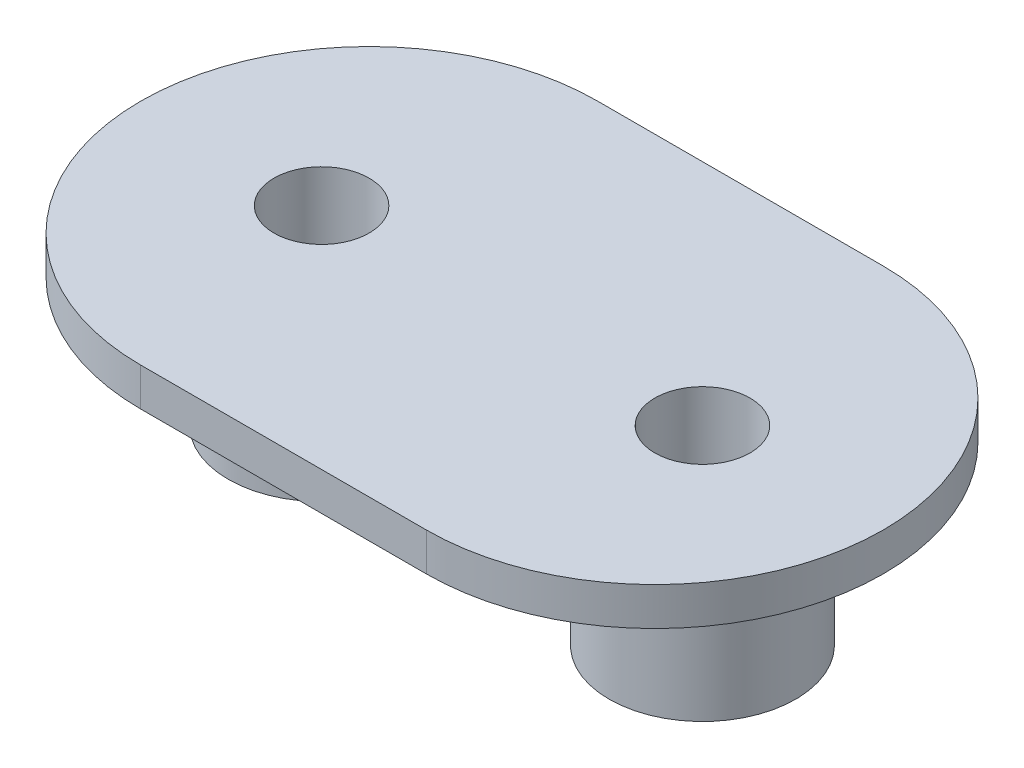
ISO-10303-21;
HEADER;
FILE_DESCRIPTION(('STEP AP214'),'2;1');
FILE_NAME('part.step','',(''),(''),'','','');
FILE_SCHEMA(('AUTOMOTIVE_DESIGN { 1 0 10303 214 1 1 1 1 }'));
ENDSEC;
DATA;
#1=APPLICATION_CONTEXT('core data for automotive mechanical design processes');
#2=APPLICATION_PROTOCOL_DEFINITION('international standard','automotive_design',2000,#1);
#3=PRODUCT_CONTEXT('',#1,'mechanical');
#4=PRODUCT('Part','Part','',(#3));
#5=PRODUCT_RELATED_PRODUCT_CATEGORY('part','',(#4));
#6=PRODUCT_DEFINITION_FORMATION('','',#4);
#7=PRODUCT_DEFINITION_CONTEXT('part definition',#1,'design');
#8=PRODUCT_DEFINITION('design','',#6,#7);
#9=PRODUCT_DEFINITION_SHAPE('','',#8);
#10=(LENGTH_UNIT() NAMED_UNIT(*) SI_UNIT(.MILLI.,.METRE.));
#11=(NAMED_UNIT(*) PLANE_ANGLE_UNIT() SI_UNIT($,.RADIAN.));
#12=(NAMED_UNIT(*) SI_UNIT($,.STERADIAN.) SOLID_ANGLE_UNIT());
#13=UNCERTAINTY_MEASURE_WITH_UNIT(LENGTH_MEASURE(1.E-05),#10,'distance_accuracy_value','');
#14=(GEOMETRIC_REPRESENTATION_CONTEXT(3) GLOBAL_UNCERTAINTY_ASSIGNED_CONTEXT((#13)) GLOBAL_UNIT_ASSIGNED_CONTEXT((#10,
#11,#12)) REPRESENTATION_CONTEXT('',''));
#15=CARTESIAN_POINT('',(0.,0.,0.));
#16=DIRECTION('',(0.,0.,1.));
#17=DIRECTION('',(1.,0.,0.));
#18=AXIS2_PLACEMENT_3D('',#15,#16,#17);
#19=CARTESIAN_POINT('',(7.5,2.,0.));
#20=DIRECTION('',(0.,-1.,0.));
#21=DIRECTION('',(0.,0.,-1.));
#22=AXIS2_PLACEMENT_3D('',#19,#20,#21);
#23=CYLINDRICAL_SURFACE('',#22,12.);
#24=CARTESIAN_POINT('',(7.5,0.,0.));
#25=DIRECTION('',(0.,1.,0.));
#26=DIRECTION('',(0.,0.,1.));
#27=AXIS2_PLACEMENT_3D('',#24,#25,#26);
#28=CIRCLE('',#27,12.);
#29=CARTESIAN_POINT('',(7.5,0.,-12.));
#30=VERTEX_POINT('',#29);
#31=CARTESIAN_POINT('',(7.5,0.,12.));
#32=VERTEX_POINT('',#31);
#33=EDGE_CURVE('E117',#30,#32,#28,.F.);
#34=ORIENTED_EDGE('',*,*,#33,.F.);
#35=DIRECTION('',(0.,-1.,0.));
#36=VECTOR('',#35,1.);
#37=CARTESIAN_POINT('',(7.5,2.,-12.));
#38=LINE('',#37,#36);
#39=CARTESIAN_POINT('',(7.5,2.,-12.));
#40=VERTEX_POINT('',#39);
#41=EDGE_CURVE('E50',#40,#30,#38,.T.);
#42=ORIENTED_EDGE('',*,*,#41,.F.);
#43=CARTESIAN_POINT('',(7.5,2.,0.));
#44=DIRECTION('',(0.,1.,0.));
#45=DIRECTION('',(0.,0.,1.));
#46=AXIS2_PLACEMENT_3D('',#43,#44,#45);
#47=CIRCLE('',#46,12.);
#48=CARTESIAN_POINT('',(7.5,2.,12.));
#49=VERTEX_POINT('',#48);
#50=EDGE_CURVE('E108',#40,#49,#47,.F.);
#51=ORIENTED_EDGE('',*,*,#50,.T.);
#52=DIRECTION('',(0.,-1.,0.));
#53=VECTOR('',#52,1.);
#54=CARTESIAN_POINT('',(7.5,2.,12.));
#55=LINE('',#54,#53);
#56=EDGE_CURVE('E82',#49,#32,#55,.T.);
#57=ORIENTED_EDGE('',*,*,#56,.T.);
#58=EDGE_LOOP('',(#34,#42,#51,#57));
#59=FACE_BOUND('',#58,.T.);
#60=ADVANCED_FACE('F41',(#59),#23,.T.);
#61=CARTESIAN_POINT('',(0.,2.,-12.));
#62=DIRECTION('',(0.,0.,-1.));
#63=DIRECTION('',(-1.,0.,0.));
#64=AXIS2_PLACEMENT_3D('',#61,#62,#63);
#65=PLANE('',#64);
#66=DIRECTION('',(1.,0.,0.));
#67=VECTOR('',#66,1.);
#68=CARTESIAN_POINT('',(0.,0.,-12.));
#69=LINE('',#68,#67);
#70=CARTESIAN_POINT('',(-7.5,0.,-12.));
#71=VERTEX_POINT('',#70);
#72=EDGE_CURVE('E95',#71,#30,#69,.T.);
#73=ORIENTED_EDGE('',*,*,#72,.F.);
#74=DIRECTION('',(0.,-1.,0.));
#75=VECTOR('',#74,1.);
#76=CARTESIAN_POINT('',(-7.5,2.,-12.));
#77=LINE('',#76,#75);
#78=CARTESIAN_POINT('',(-7.5,2.,-12.));
#79=VERTEX_POINT('',#78);
#80=EDGE_CURVE('E89',#79,#71,#77,.T.);
#81=ORIENTED_EDGE('',*,*,#80,.F.);
#82=DIRECTION('',(1.,0.,0.));
#83=VECTOR('',#82,1.);
#84=CARTESIAN_POINT('',(0.,2.,-12.));
#85=LINE('',#84,#83);
#86=EDGE_CURVE('E93',#79,#40,#85,.T.);
#87=ORIENTED_EDGE('',*,*,#86,.T.);
#88=ORIENTED_EDGE('',*,*,#41,.T.);
#89=EDGE_LOOP('',(#73,#81,#87,#88));
#90=FACE_BOUND('',#89,.T.);
#91=ADVANCED_FACE('F91',(#90),#65,.T.);
#92=CARTESIAN_POINT('',(-7.5,2.,0.));
#93=DIRECTION('',(0.,-1.,0.));
#94=DIRECTION('',(0.,0.,-1.));
#95=AXIS2_PLACEMENT_3D('',#92,#93,#94);
#96=CYLINDRICAL_SURFACE('',#95,12.);
#97=CARTESIAN_POINT('',(-7.5,0.,0.));
#98=DIRECTION('',(0.,1.,0.));
#99=DIRECTION('',(0.,0.,1.));
#100=AXIS2_PLACEMENT_3D('',#97,#98,#99);
#101=CIRCLE('',#100,12.);
#102=CARTESIAN_POINT('',(-7.5,0.,12.));
#103=VERTEX_POINT('',#102);
#104=EDGE_CURVE('E123',#71,#103,#101,.T.);
#105=ORIENTED_EDGE('',*,*,#104,.T.);
#106=DIRECTION('',(0.,-1.,0.));
#107=VECTOR('',#106,1.);
#108=CARTESIAN_POINT('',(-7.5,2.,12.));
#109=LINE('',#108,#107);
#110=CARTESIAN_POINT('',(-7.5,2.,12.));
#111=VERTEX_POINT('',#110);
#112=EDGE_CURVE('E99',#111,#103,#109,.T.);
#113=ORIENTED_EDGE('',*,*,#112,.F.);
#114=CARTESIAN_POINT('',(-7.5,2.,0.));
#115=DIRECTION('',(0.,1.,0.));
#116=DIRECTION('',(0.,0.,1.));
#117=AXIS2_PLACEMENT_3D('',#114,#115,#116);
#118=CIRCLE('',#117,12.);
#119=EDGE_CURVE('E102',#79,#111,#118,.T.);
#120=ORIENTED_EDGE('',*,*,#119,.F.);
#121=ORIENTED_EDGE('',*,*,#80,.T.);
#122=EDGE_LOOP('',(#105,#113,#120,#121));
#123=FACE_BOUND('',#122,.T.);
#124=ADVANCED_FACE('F103',(#123),#96,.T.);
#125=CARTESIAN_POINT('',(0.,2.,12.));
#126=DIRECTION('',(0.,0.,-1.));
#127=DIRECTION('',(-1.,0.,0.));
#128=AXIS2_PLACEMENT_3D('',#125,#126,#127);
#129=PLANE('',#128);
#130=DIRECTION('',(1.,0.,0.));
#131=VECTOR('',#130,1.);
#132=CARTESIAN_POINT('',(0.,0.,12.));
#133=LINE('',#132,#131);
#134=EDGE_CURVE('E75',#103,#32,#133,.T.);
#135=ORIENTED_EDGE('',*,*,#134,.T.);
#136=ORIENTED_EDGE('',*,*,#56,.F.);
#137=DIRECTION('',(1.,0.,0.));
#138=VECTOR('',#137,1.);
#139=CARTESIAN_POINT('',(0.,2.,12.));
#140=LINE('',#139,#138);
#141=EDGE_CURVE('E58',#111,#49,#140,.T.);
#142=ORIENTED_EDGE('',*,*,#141,.F.);
#143=ORIENTED_EDGE('',*,*,#112,.T.);
#144=EDGE_LOOP('',(#135,#136,#142,#143));
#145=FACE_BOUND('',#144,.T.);
#146=ADVANCED_FACE('F193',(#145),#129,.F.);
#147=CARTESIAN_POINT('',(0.,2.,0.));
#148=DIRECTION('',(0.,1.,0.));
#149=DIRECTION('',(0.,0.,1.));
#150=AXIS2_PLACEMENT_3D('',#147,#148,#149);
#151=PLANE('',#150);
#152=ORIENTED_EDGE('',*,*,#50,.F.);
#153=ORIENTED_EDGE('',*,*,#86,.F.);
#154=ORIENTED_EDGE('',*,*,#119,.T.);
#155=ORIENTED_EDGE('',*,*,#141,.T.);
#156=EDGE_LOOP('',(#152,#153,#154,#155));
#157=FACE_BOUND('',#156,.T.);
#158=CARTESIAN_POINT('',(-10.,2.,0.));
#159=DIRECTION('',(0.,1.,0.));
#160=DIRECTION('',(0.,0.,1.));
#161=AXIS2_PLACEMENT_3D('',#158,#159,#160);
#162=CIRCLE('',#161,2.5);
#163=CARTESIAN_POINT('',(-10.,2.,2.5));
#164=VERTEX_POINT('',#163);
#165=EDGE_CURVE('E155',#164,#164,#162,.T.);
#166=ORIENTED_EDGE('',*,*,#165,.F.);
#167=EDGE_LOOP('',(#166));
#168=FACE_BOUND('',#167,.T.);
#169=CARTESIAN_POINT('',(10.,2.,0.));
#170=DIRECTION('',(0.,1.,0.));
#171=DIRECTION('',(0.,0.,1.));
#172=AXIS2_PLACEMENT_3D('',#169,#170,#171);
#173=CIRCLE('',#172,2.5);
#174=CARTESIAN_POINT('',(10.,2.,2.5));
#175=VERTEX_POINT('',#174);
#176=EDGE_CURVE('E142',#175,#175,#173,.T.);
#177=ORIENTED_EDGE('',*,*,#176,.F.);
#178=EDGE_LOOP('',(#177));
#179=FACE_BOUND('',#178,.T.);
#180=ADVANCED_FACE('F106',(#157,#168,#179),#151,.T.);
#181=CARTESIAN_POINT('',(0.,0.,0.));
#182=DIRECTION('',(0.,1.,0.));
#183=DIRECTION('',(0.,0.,1.));
#184=AXIS2_PLACEMENT_3D('',#181,#182,#183);
#185=PLANE('',#184);
#186=CARTESIAN_POINT('',(-10.,0.,0.));
#187=DIRECTION('',(0.,1.,0.));
#188=DIRECTION('',(0.,0.,1.));
#189=AXIS2_PLACEMENT_3D('',#186,#187,#188);
#190=CIRCLE('',#189,4.9);
#191=CARTESIAN_POINT('',(-10.,0.,4.9));
#192=VERTEX_POINT('',#191);
#193=EDGE_CURVE('E11',#192,#192,#190,.F.);
#194=ORIENTED_EDGE('',*,*,#193,.F.);
#195=EDGE_LOOP('',(#194));
#196=FACE_BOUND('',#195,.T.);
#197=ORIENTED_EDGE('',*,*,#33,.T.);
#198=ORIENTED_EDGE('',*,*,#134,.F.);
#199=ORIENTED_EDGE('',*,*,#104,.F.);
#200=ORIENTED_EDGE('',*,*,#72,.T.);
#201=EDGE_LOOP('',(#197,#198,#199,#200));
#202=FACE_BOUND('',#201,.T.);
#203=CARTESIAN_POINT('',(10.,0.,0.));
#204=DIRECTION('',(0.,1.,0.));
#205=DIRECTION('',(0.,0.,1.));
#206=AXIS2_PLACEMENT_3D('',#203,#204,#205);
#207=CIRCLE('',#206,4.9);
#208=CARTESIAN_POINT('',(10.,0.,4.9));
#209=VERTEX_POINT('',#208);
#210=EDGE_CURVE('E120',#209,#209,#207,.F.);
#211=ORIENTED_EDGE('',*,*,#210,.F.);
#212=EDGE_LOOP('',(#211));
#213=FACE_BOUND('',#212,.T.);
#214=ADVANCED_FACE('F132',(#196,#202,#213),#185,.F.);
#215=CARTESIAN_POINT('',(10.,2.,0.));
#216=DIRECTION('',(0.,-1.,0.));
#217=DIRECTION('',(0.,0.,-1.));
#218=AXIS2_PLACEMENT_3D('',#215,#216,#217);
#219=CYLINDRICAL_SURFACE('',#218,4.9);
#220=CARTESIAN_POINT('',(10.,-8.,0.));
#221=DIRECTION('',(0.,1.,0.));
#222=DIRECTION('',(0.,0.,1.));
#223=AXIS2_PLACEMENT_3D('',#220,#221,#222);
#224=CIRCLE('',#223,4.9);
#225=CARTESIAN_POINT('',(10.,-8.,4.9));
#226=VERTEX_POINT('',#225);
#227=EDGE_CURVE('E145',#226,#226,#224,.T.);
#228=ORIENTED_EDGE('',*,*,#227,.T.);
#229=EDGE_LOOP('',(#228));
#230=FACE_BOUND('',#229,.T.);
#231=ORIENTED_EDGE('',*,*,#210,.T.);
#232=EDGE_LOOP('',(#231));
#233=FACE_BOUND('',#232,.T.);
#234=ADVANCED_FACE('F135',(#230,#233),#219,.T.);
#235=CARTESIAN_POINT('',(10.,2.,0.));
#236=DIRECTION('',(0.,-1.,0.));
#237=DIRECTION('',(0.,0.,-1.));
#238=AXIS2_PLACEMENT_3D('',#235,#236,#237);
#239=CYLINDRICAL_SURFACE('',#238,2.5);
#240=ORIENTED_EDGE('',*,*,#176,.T.);
#241=EDGE_LOOP('',(#240));
#242=FACE_BOUND('',#241,.T.);
#243=CARTESIAN_POINT('',(10.,-8.,0.));
#244=DIRECTION('',(0.,1.,0.));
#245=DIRECTION('',(0.,0.,1.));
#246=AXIS2_PLACEMENT_3D('',#243,#244,#245);
#247=CIRCLE('',#246,2.5);
#248=CARTESIAN_POINT('',(10.,-8.,2.5));
#249=VERTEX_POINT('',#248);
#250=EDGE_CURVE('E151',#249,#249,#247,.T.);
#251=ORIENTED_EDGE('',*,*,#250,.F.);
#252=EDGE_LOOP('',(#251));
#253=FACE_BOUND('',#252,.T.);
#254=ADVANCED_FACE('F201',(#242,#253),#239,.F.);
#255=CARTESIAN_POINT('',(0.,-8.,0.));
#256=DIRECTION('',(0.,1.,0.));
#257=DIRECTION('',(0.,0.,1.));
#258=AXIS2_PLACEMENT_3D('',#255,#256,#257);
#259=PLANE('',#258);
#260=ORIENTED_EDGE('',*,*,#250,.T.);
#261=EDGE_LOOP('',(#260));
#262=FACE_BOUND('',#261,.T.);
#263=ORIENTED_EDGE('',*,*,#227,.F.);
#264=EDGE_LOOP('',(#263));
#265=FACE_BOUND('',#264,.T.);
#266=ADVANCED_FACE('F184',(#262,#265),#259,.F.);
#267=CARTESIAN_POINT('',(-10.,2.,0.));
#268=DIRECTION('',(0.,-1.,0.));
#269=DIRECTION('',(0.,0.,-1.));
#270=AXIS2_PLACEMENT_3D('',#267,#268,#269);
#271=CYLINDRICAL_SURFACE('',#270,4.9);
#272=CARTESIAN_POINT('',(-10.,-8.,0.));
#273=DIRECTION('',(0.,1.,0.));
#274=DIRECTION('',(0.,0.,1.));
#275=AXIS2_PLACEMENT_3D('',#272,#273,#274);
#276=CIRCLE('',#275,4.9);
#277=CARTESIAN_POINT('',(-10.,-8.,4.9));
#278=VERTEX_POINT('',#277);
#279=EDGE_CURVE('E163',#278,#278,#276,.T.);
#280=ORIENTED_EDGE('',*,*,#279,.T.);
#281=EDGE_LOOP('',(#280));
#282=FACE_BOUND('',#281,.T.);
#283=ORIENTED_EDGE('',*,*,#193,.T.);
#284=EDGE_LOOP('',(#283));
#285=FACE_BOUND('',#284,.T.);
#286=ADVANCED_FACE('F168',(#282,#285),#271,.T.);
#287=CARTESIAN_POINT('',(-10.,2.,0.));
#288=DIRECTION('',(0.,-1.,0.));
#289=DIRECTION('',(0.,0.,-1.));
#290=AXIS2_PLACEMENT_3D('',#287,#288,#289);
#291=CYLINDRICAL_SURFACE('',#290,2.5);
#292=ORIENTED_EDGE('',*,*,#165,.T.);
#293=EDGE_LOOP('',(#292));
#294=FACE_BOUND('',#293,.T.);
#295=CARTESIAN_POINT('',(-10.,-8.,0.));
#296=DIRECTION('',(0.,1.,0.));
#297=DIRECTION('',(0.,0.,1.));
#298=AXIS2_PLACEMENT_3D('',#295,#296,#297);
#299=CIRCLE('',#298,2.5);
#300=CARTESIAN_POINT('',(-10.,-8.,2.5));
#301=VERTEX_POINT('',#300);
#302=EDGE_CURVE('E159',#301,#301,#299,.T.);
#303=ORIENTED_EDGE('',*,*,#302,.F.);
#304=EDGE_LOOP('',(#303));
#305=FACE_BOUND('',#304,.T.);
#306=ADVANCED_FACE('F174',(#294,#305),#291,.F.);
#307=CARTESIAN_POINT('',(0.,-8.,0.));
#308=DIRECTION('',(0.,1.,0.));
#309=DIRECTION('',(0.,0.,1.));
#310=AXIS2_PLACEMENT_3D('',#307,#308,#309);
#311=PLANE('',#310);
#312=ORIENTED_EDGE('',*,*,#279,.F.);
#313=EDGE_LOOP('',(#312));
#314=FACE_BOUND('',#313,.T.);
#315=ORIENTED_EDGE('',*,*,#302,.T.);
#316=EDGE_LOOP('',(#315));
#317=FACE_BOUND('',#316,.T.);
#318=ADVANCED_FACE('F171',(#314,#317),#311,.F.);
#319=CLOSED_SHELL('',(#60,#91,#124,#146,#180,#214,#234,#254,#266,#286,#306,#318));
#320=MANIFOLD_SOLID_BREP('B2',#319);
#321=ADVANCED_BREP_SHAPE_REPRESENTATION('',(#18,#320),#14);
#322=SHAPE_DEFINITION_REPRESENTATION(#9,#321);
ENDSEC;
END-ISO-10303-21;
